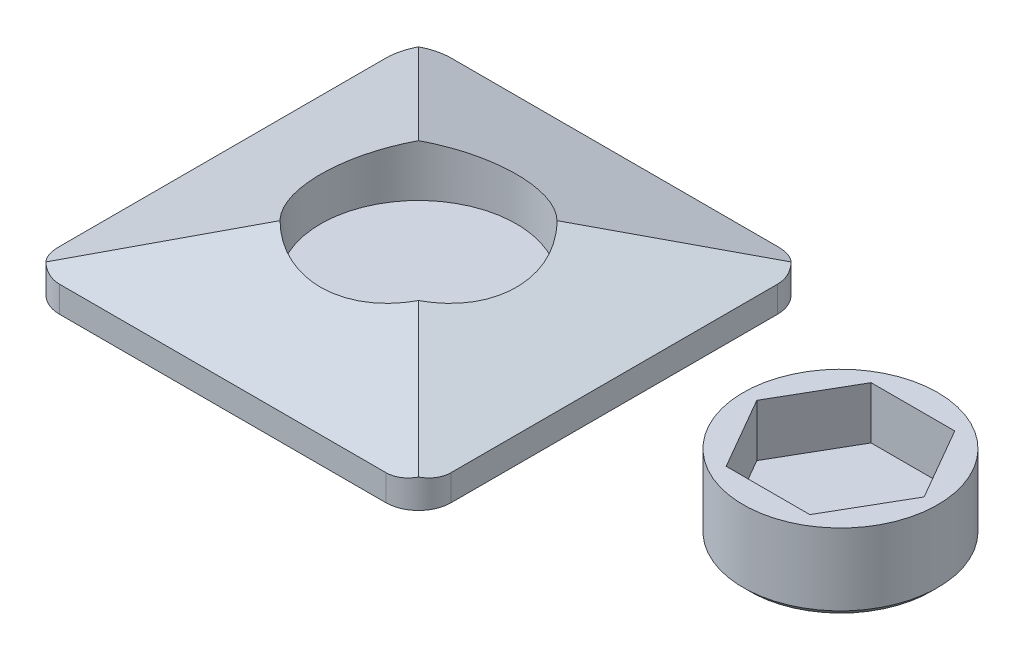
ISO-10303-21;
HEADER;
FILE_DESCRIPTION(('STEP AP214'),'2;1');
FILE_NAME('part.step','',(''),(''),'','','');
FILE_SCHEMA(('AUTOMOTIVE_DESIGN { 1 0 10303 214 1 1 1 1 }'));
ENDSEC;
DATA;
#1=APPLICATION_CONTEXT('core data for automotive mechanical design processes');
#2=APPLICATION_PROTOCOL_DEFINITION('international standard','automotive_design',2000,#1);
#3=PRODUCT_CONTEXT('',#1,'mechanical');
#4=PRODUCT('Part','Part','',(#3));
#5=PRODUCT_RELATED_PRODUCT_CATEGORY('part','',(#4));
#6=PRODUCT_DEFINITION_FORMATION('','',#4);
#7=PRODUCT_DEFINITION_CONTEXT('part definition',#1,'design');
#8=PRODUCT_DEFINITION('design','',#6,#7);
#9=PRODUCT_DEFINITION_SHAPE('','',#8);
#10=(LENGTH_UNIT() NAMED_UNIT(*) SI_UNIT(.MILLI.,.METRE.));
#11=(NAMED_UNIT(*) PLANE_ANGLE_UNIT() SI_UNIT($,.RADIAN.));
#12=(NAMED_UNIT(*) SI_UNIT($,.STERADIAN.) SOLID_ANGLE_UNIT());
#13=UNCERTAINTY_MEASURE_WITH_UNIT(LENGTH_MEASURE(1.E-05),#10,'distance_accuracy_value','');
#14=(GEOMETRIC_REPRESENTATION_CONTEXT(3) GLOBAL_UNCERTAINTY_ASSIGNED_CONTEXT((#13)) GLOBAL_UNIT_ASSIGNED_CONTEXT((#10,
#11,#12)) REPRESENTATION_CONTEXT('',''));
#15=CARTESIAN_POINT('',(0.,0.,0.));
#16=DIRECTION('',(0.,0.,1.));
#17=DIRECTION('',(1.,0.,0.));
#18=AXIS2_PLACEMENT_3D('',#15,#16,#17);
#19=CARTESIAN_POINT('',(64.6418358895324,12.,0.));
#20=DIRECTION('',(0.,-1.,0.));
#21=DIRECTION('',(0.,0.,-1.));
#22=AXIS2_PLACEMENT_3D('',#19,#20,#21);
#23=CYLINDRICAL_SURFACE('',#22,14.9);
#24=CARTESIAN_POINT('',(64.6418358895324,0.999999999999989,0.));
#25=DIRECTION('',(0.,-1.,0.));
#26=DIRECTION('',(0.,0.,-1.));
#27=AXIS2_PLACEMENT_3D('',#24,#25,#26);
#28=CIRCLE('',#27,14.9);
#29=CARTESIAN_POINT('',(64.6418358895324,0.999999999999989,-14.9));
#30=VERTEX_POINT('',#29);
#31=EDGE_CURVE('E12',#30,#30,#28,.F.);
#32=ORIENTED_EDGE('',*,*,#31,.T.);
#33=EDGE_LOOP('',(#32));
#34=FACE_BOUND('',#33,.T.);
#35=CARTESIAN_POINT('',(64.6418358895324,12.,0.));
#36=DIRECTION('',(0.,-1.,0.));
#37=DIRECTION('',(0.,0.,-1.));
#38=AXIS2_PLACEMENT_3D('',#35,#36,#37);
#39=CIRCLE('',#38,14.9);
#40=CARTESIAN_POINT('',(64.6418358895324,12.,-14.9));
#41=VERTEX_POINT('',#40);
#42=EDGE_CURVE('E154',#41,#41,#39,.T.);
#43=ORIENTED_EDGE('',*,*,#42,.T.);
#44=EDGE_LOOP('',(#43));
#45=FACE_BOUND('',#44,.T.);
#46=ADVANCED_FACE('F51',(#34,#45),#23,.T.);
#47=CARTESIAN_POINT('',(64.6418358895324,12.,0.));
#48=DIRECTION('',(0.,-1.,0.));
#49=DIRECTION('',(0.,0.,-1.));
#50=AXIS2_PLACEMENT_3D('',#47,#48,#49);
#51=PLANE('',#50);
#52=DIRECTION('',(-0.5,0.,-0.866025403784438));
#53=VECTOR('',#52,1.);
#54=CARTESIAN_POINT('',(77.4590118655421,12.,0.));
#55=LINE('',#54,#53);
#56=CARTESIAN_POINT('',(77.4590118655421,12.,0.));
#57=VERTEX_POINT('',#56);
#58=CARTESIAN_POINT('',(71.0504238775373,12.,-11.1));
#59=VERTEX_POINT('',#58);
#60=EDGE_CURVE('E141',#57,#59,#55,.T.);
#61=ORIENTED_EDGE('',*,*,#60,.F.);
#62=DIRECTION('',(0.5,0.,-0.866025403784439));
#63=VECTOR('',#62,1.);
#64=CARTESIAN_POINT('',(71.0504238775373,12.,11.1));
#65=LINE('',#64,#63);
#66=CARTESIAN_POINT('',(71.0504238775373,12.,11.1));
#67=VERTEX_POINT('',#66);
#68=EDGE_CURVE('E67',#67,#57,#65,.T.);
#69=ORIENTED_EDGE('',*,*,#68,.F.);
#70=DIRECTION('',(1.,0.,0.));
#71=VECTOR('',#70,1.);
#72=CARTESIAN_POINT('',(58.2332479015276,12.,11.1));
#73=LINE('',#72,#71);
#74=CARTESIAN_POINT('',(58.2332479015276,12.,11.1));
#75=VERTEX_POINT('',#74);
#76=EDGE_CURVE('E150',#75,#67,#73,.T.);
#77=ORIENTED_EDGE('',*,*,#76,.F.);
#78=DIRECTION('',(0.5,0.,0.866025403784439));
#79=VECTOR('',#78,1.);
#80=CARTESIAN_POINT('',(51.8246599135227,12.,0.));
#81=LINE('',#80,#79);
#82=CARTESIAN_POINT('',(51.8246599135227,12.,0.));
#83=VERTEX_POINT('',#82);
#84=EDGE_CURVE('E148',#83,#75,#81,.T.);
#85=ORIENTED_EDGE('',*,*,#84,.F.);
#86=DIRECTION('',(-0.5,0.,0.866025403784439));
#87=VECTOR('',#86,1.);
#88=CARTESIAN_POINT('',(58.2332479015276,12.,-11.1));
#89=LINE('',#88,#87);
#90=CARTESIAN_POINT('',(58.2332479015276,12.,-11.1));
#91=VERTEX_POINT('',#90);
#92=EDGE_CURVE('E115',#91,#83,#89,.T.);
#93=ORIENTED_EDGE('',*,*,#92,.F.);
#94=DIRECTION('',(-1.,0.,0.));
#95=VECTOR('',#94,1.);
#96=CARTESIAN_POINT('',(71.0504238775373,12.,-11.1));
#97=LINE('',#96,#95);
#98=EDGE_CURVE('E144',#59,#91,#97,.T.);
#99=ORIENTED_EDGE('',*,*,#98,.F.);
#100=EDGE_LOOP('',(#61,#69,#77,#85,#93,#99));
#101=FACE_BOUND('',#100,.T.);
#102=ORIENTED_EDGE('',*,*,#42,.F.);
#103=EDGE_LOOP('',(#102));
#104=FACE_BOUND('',#103,.T.);
#105=ADVANCED_FACE('F175',(#101,#104),#51,.F.);
#106=CARTESIAN_POINT('',(64.6418358895324,0.,0.));
#107=DIRECTION('',(0.,-1.,0.));
#108=DIRECTION('',(0.,0.,-1.));
#109=AXIS2_PLACEMENT_3D('',#106,#107,#108);
#110=PLANE('',#109);
#111=CARTESIAN_POINT('',(64.6418358895324,0.,0.));
#112=DIRECTION('',(0.,-1.,0.));
#113=DIRECTION('',(0.,0.,-1.));
#114=AXIS2_PLACEMENT_3D('',#111,#112,#113);
#115=CIRCLE('',#114,13.9);
#116=CARTESIAN_POINT('',(64.6418358895324,0.,-13.9));
#117=VERTEX_POINT('',#116);
#118=EDGE_CURVE('E60',#117,#117,#115,.T.);
#119=ORIENTED_EDGE('',*,*,#118,.T.);
#120=EDGE_LOOP('',(#119));
#121=FACE_BOUND('',#120,.T.);
#122=ADVANCED_FACE('F164',(#121),#110,.T.);
#123=CARTESIAN_POINT('',(71.0504238775373,4.,11.1));
#124=DIRECTION('',(0.866025403784439,0.,0.5));
#125=DIRECTION('',(0.5,0.,-0.866025403784439));
#126=AXIS2_PLACEMENT_3D('',#123,#124,#125);
#127=PLANE('',#126);
#128=ORIENTED_EDGE('',*,*,#68,.T.);
#129=DIRECTION('',(0.,1.,0.));
#130=VECTOR('',#129,1.);
#131=CARTESIAN_POINT('',(77.4590118655421,4.,0.));
#132=LINE('',#131,#130);
#133=CARTESIAN_POINT('',(77.4590118655421,4.,0.));
#134=VERTEX_POINT('',#133);
#135=EDGE_CURVE('E97',#134,#57,#132,.T.);
#136=ORIENTED_EDGE('',*,*,#135,.F.);
#137=DIRECTION('',(0.5,0.,-0.866025403784439));
#138=VECTOR('',#137,1.);
#139=CARTESIAN_POINT('',(71.0504238775373,4.,11.1));
#140=LINE('',#139,#138);
#141=CARTESIAN_POINT('',(71.0504238775373,4.,11.1));
#142=VERTEX_POINT('',#141);
#143=EDGE_CURVE('E152',#142,#134,#140,.T.);
#144=ORIENTED_EDGE('',*,*,#143,.F.);
#145=DIRECTION('',(0.,1.,0.));
#146=VECTOR('',#145,1.);
#147=CARTESIAN_POINT('',(71.0504238775373,4.,11.1));
#148=LINE('',#147,#146);
#149=EDGE_CURVE('E75',#142,#67,#148,.T.);
#150=ORIENTED_EDGE('',*,*,#149,.T.);
#151=EDGE_LOOP('',(#128,#136,#144,#150));
#152=FACE_BOUND('',#151,.T.);
#153=ADVANCED_FACE('F185',(#152),#127,.F.);
#154=CARTESIAN_POINT('',(58.2332479015276,4.,11.1));
#155=DIRECTION('',(0.,0.,1.));
#156=DIRECTION('',(1.,0.,0.));
#157=AXIS2_PLACEMENT_3D('',#154,#155,#156);
#158=PLANE('',#157);
#159=ORIENTED_EDGE('',*,*,#76,.T.);
#160=ORIENTED_EDGE('',*,*,#149,.F.);
#161=DIRECTION('',(1.,0.,0.));
#162=VECTOR('',#161,1.);
#163=CARTESIAN_POINT('',(58.2332479015276,4.,11.1));
#164=LINE('',#163,#162);
#165=CARTESIAN_POINT('',(58.2332479015276,4.,11.1));
#166=VERTEX_POINT('',#165);
#167=EDGE_CURVE('E127',#166,#142,#164,.T.);
#168=ORIENTED_EDGE('',*,*,#167,.F.);
#169=DIRECTION('',(0.,1.,0.));
#170=VECTOR('',#169,1.);
#171=CARTESIAN_POINT('',(58.2332479015276,4.,11.1));
#172=LINE('',#171,#170);
#173=EDGE_CURVE('E119',#166,#75,#172,.T.);
#174=ORIENTED_EDGE('',*,*,#173,.T.);
#175=EDGE_LOOP('',(#159,#160,#168,#174));
#176=FACE_BOUND('',#175,.T.);
#177=ADVANCED_FACE('F189',(#176),#158,.F.);
#178=CARTESIAN_POINT('',(51.8246599135227,4.,0.));
#179=DIRECTION('',(-0.866025403784439,0.,0.5));
#180=DIRECTION('',(0.5,0.,0.866025403784439));
#181=AXIS2_PLACEMENT_3D('',#178,#179,#180);
#182=PLANE('',#181);
#183=ORIENTED_EDGE('',*,*,#84,.T.);
#184=ORIENTED_EDGE('',*,*,#173,.F.);
#185=DIRECTION('',(0.5,0.,0.866025403784439));
#186=VECTOR('',#185,1.);
#187=CARTESIAN_POINT('',(51.8246599135227,4.,0.));
#188=LINE('',#187,#186);
#189=CARTESIAN_POINT('',(51.8246599135227,4.,0.));
#190=VERTEX_POINT('',#189);
#191=EDGE_CURVE('E123',#190,#166,#188,.T.);
#192=ORIENTED_EDGE('',*,*,#191,.F.);
#193=DIRECTION('',(0.,1.,0.));
#194=VECTOR('',#193,1.);
#195=CARTESIAN_POINT('',(51.8246599135227,4.,0.));
#196=LINE('',#195,#194);
#197=EDGE_CURVE('E108',#190,#83,#196,.T.);
#198=ORIENTED_EDGE('',*,*,#197,.T.);
#199=EDGE_LOOP('',(#183,#184,#192,#198));
#200=FACE_BOUND('',#199,.T.);
#201=ADVANCED_FACE('F124',(#200),#182,.F.);
#202=CARTESIAN_POINT('',(58.2332479015276,4.,-11.1));
#203=DIRECTION('',(-0.866025403784439,0.,-0.5));
#204=DIRECTION('',(-0.5,0.,0.866025403784439));
#205=AXIS2_PLACEMENT_3D('',#202,#203,#204);
#206=PLANE('',#205);
#207=ORIENTED_EDGE('',*,*,#92,.T.);
#208=ORIENTED_EDGE('',*,*,#197,.F.);
#209=DIRECTION('',(-0.5,0.,0.866025403784439));
#210=VECTOR('',#209,1.);
#211=CARTESIAN_POINT('',(58.2332479015276,4.,-11.1));
#212=LINE('',#211,#210);
#213=CARTESIAN_POINT('',(58.2332479015276,4.,-11.1));
#214=VERTEX_POINT('',#213);
#215=EDGE_CURVE('E112',#214,#190,#212,.T.);
#216=ORIENTED_EDGE('',*,*,#215,.F.);
#217=DIRECTION('',(0.,1.,0.));
#218=VECTOR('',#217,1.);
#219=CARTESIAN_POINT('',(58.2332479015276,4.,-11.1));
#220=LINE('',#219,#218);
#221=EDGE_CURVE('E120',#214,#91,#220,.T.);
#222=ORIENTED_EDGE('',*,*,#221,.T.);
#223=EDGE_LOOP('',(#207,#208,#216,#222));
#224=FACE_BOUND('',#223,.T.);
#225=ADVANCED_FACE('F110',(#224),#206,.F.);
#226=CARTESIAN_POINT('',(71.0504238775373,4.,-11.1));
#227=DIRECTION('',(0.,0.,-1.));
#228=DIRECTION('',(-1.,0.,0.));
#229=AXIS2_PLACEMENT_3D('',#226,#227,#228);
#230=PLANE('',#229);
#231=ORIENTED_EDGE('',*,*,#98,.T.);
#232=ORIENTED_EDGE('',*,*,#221,.F.);
#233=DIRECTION('',(-1.,0.,0.));
#234=VECTOR('',#233,1.);
#235=CARTESIAN_POINT('',(71.0504238775373,4.,-11.1));
#236=LINE('',#235,#234);
#237=CARTESIAN_POINT('',(71.0504238775373,4.,-11.1));
#238=VERTEX_POINT('',#237);
#239=EDGE_CURVE('E133',#238,#214,#236,.T.);
#240=ORIENTED_EDGE('',*,*,#239,.F.);
#241=DIRECTION('',(0.,1.,0.));
#242=VECTOR('',#241,1.);
#243=CARTESIAN_POINT('',(71.0504238775373,4.,-11.1));
#244=LINE('',#243,#242);
#245=EDGE_CURVE('E157',#238,#59,#244,.T.);
#246=ORIENTED_EDGE('',*,*,#245,.T.);
#247=EDGE_LOOP('',(#231,#232,#240,#246));
#248=FACE_BOUND('',#247,.T.);
#249=ADVANCED_FACE('F192',(#248),#230,.F.);
#250=CARTESIAN_POINT('',(77.4590118655421,4.,0.));
#251=DIRECTION('',(0.866025403784439,0.,-0.5));
#252=DIRECTION('',(-0.5,0.,-0.866025403784438));
#253=AXIS2_PLACEMENT_3D('',#250,#251,#252);
#254=PLANE('',#253);
#255=ORIENTED_EDGE('',*,*,#60,.T.);
#256=ORIENTED_EDGE('',*,*,#245,.F.);
#257=DIRECTION('',(-0.5,0.,-0.866025403784438));
#258=VECTOR('',#257,1.);
#259=CARTESIAN_POINT('',(77.4590118655421,4.,0.));
#260=LINE('',#259,#258);
#261=EDGE_CURVE('E135',#134,#238,#260,.T.);
#262=ORIENTED_EDGE('',*,*,#261,.F.);
#263=ORIENTED_EDGE('',*,*,#135,.T.);
#264=EDGE_LOOP('',(#255,#256,#262,#263));
#265=FACE_BOUND('',#264,.T.);
#266=ADVANCED_FACE('F171',(#265),#254,.F.);
#267=CARTESIAN_POINT('',(0.,4.,0.));
#268=DIRECTION('',(0.,1.,0.));
#269=DIRECTION('',(0.,0.,1.));
#270=AXIS2_PLACEMENT_3D('',#267,#268,#269);
#271=PLANE('',#270);
#272=ORIENTED_EDGE('',*,*,#143,.T.);
#273=ORIENTED_EDGE('',*,*,#261,.T.);
#274=ORIENTED_EDGE('',*,*,#239,.T.);
#275=ORIENTED_EDGE('',*,*,#215,.T.);
#276=ORIENTED_EDGE('',*,*,#191,.T.);
#277=ORIENTED_EDGE('',*,*,#167,.T.);
#278=EDGE_LOOP('',(#272,#273,#274,#275,#276,#277));
#279=FACE_BOUND('',#278,.T.);
#280=ADVANCED_FACE('F130',(#279),#271,.T.);
#281=CARTESIAN_POINT('',(64.6418358895324,0.,0.));
#282=DIRECTION('',(0.,1.,0.));
#283=DIRECTION('',(0.,0.,1.));
#284=AXIS2_PLACEMENT_3D('',#281,#282,#283);
#285=CONICAL_SURFACE('',#284,13.9,0.785398163397447);
#286=ORIENTED_EDGE('',*,*,#31,.F.);
#287=EDGE_LOOP('',(#286));
#288=FACE_BOUND('',#287,.T.);
#289=ORIENTED_EDGE('',*,*,#118,.F.);
#290=EDGE_LOOP('',(#289));
#291=FACE_BOUND('',#290,.T.);
#292=ADVANCED_FACE('F54',(#288,#291),#285,.T.);
#293=CLOSED_SHELL('',(#46,#105,#122,#153,#177,#201,#225,#249,#266,#280,#292));
#294=MANIFOLD_SOLID_BREP('B2',#293);
#295=CARTESIAN_POINT('',(30.,10.,-30.));
#296=DIRECTION('',(-1.,0.,0.));
#297=DIRECTION('',(0.,0.,1.));
#298=AXIS2_PLACEMENT_3D('',#295,#296,#297);
#299=PLANE('',#298);
#300=DIRECTION('',(0.,0.,-1.));
#301=VECTOR('',#300,1.);
#302=CARTESIAN_POINT('',(30.,0.,-30.));
#303=LINE('',#302,#301);
#304=CARTESIAN_POINT('',(30.,0.,25.));
#305=VERTEX_POINT('',#304);
#306=CARTESIAN_POINT('',(30.,0.,-25.));
#307=VERTEX_POINT('',#306);
#308=EDGE_CURVE('E497',#305,#307,#303,.T.);
#309=ORIENTED_EDGE('',*,*,#308,.T.);
#310=DIRECTION('',(0.,-1.,0.));
#311=VECTOR('',#310,1.);
#312=CARTESIAN_POINT('',(30.,10.,-25.));
#313=LINE('',#312,#311);
#314=CARTESIAN_POINT('',(30.,3.99999999999986,-25.));
#315=VERTEX_POINT('',#314);
#316=EDGE_CURVE('E340',#307,#315,#313,.F.);
#317=ORIENTED_EDGE('',*,*,#316,.T.);
#318=DIRECTION('',(0.,0.,1.));
#319=VECTOR('',#318,1.);
#320=CARTESIAN_POINT('',(30.,3.99999999999986,30.));
#321=LINE('',#320,#319);
#322=CARTESIAN_POINT('',(30.,3.99999999999986,25.));
#323=VERTEX_POINT('',#322);
#324=EDGE_CURVE('E452',#315,#323,#321,.T.);
#325=ORIENTED_EDGE('',*,*,#324,.T.);
#326=DIRECTION('',(0.,-1.,0.));
#327=VECTOR('',#326,1.);
#328=CARTESIAN_POINT('',(30.,10.,25.));
#329=LINE('',#328,#327);
#330=EDGE_CURVE('E492',#323,#305,#329,.T.);
#331=ORIENTED_EDGE('',*,*,#330,.T.);
#332=EDGE_LOOP('',(#309,#317,#325,#331));
#333=FACE_BOUND('',#332,.T.);
#334=ADVANCED_FACE('F319',(#333),#299,.F.);
#335=CARTESIAN_POINT('',(-30.,10.,-30.));
#336=DIRECTION('',(0.,0.,1.));
#337=DIRECTION('',(1.,0.,0.));
#338=AXIS2_PLACEMENT_3D('',#335,#336,#337);
#339=PLANE('',#338);
#340=DIRECTION('',(-1.,0.,0.));
#341=VECTOR('',#340,1.);
#342=CARTESIAN_POINT('',(-30.,0.,-30.));
#343=LINE('',#342,#341);
#344=CARTESIAN_POINT('',(25.,0.,-30.));
#345=VERTEX_POINT('',#344);
#346=CARTESIAN_POINT('',(-25.,0.,-30.));
#347=VERTEX_POINT('',#346);
#348=EDGE_CURVE('E504',#345,#347,#343,.T.);
#349=ORIENTED_EDGE('',*,*,#348,.T.);
#350=DIRECTION('',(0.,-1.,0.));
#351=VECTOR('',#350,1.);
#352=CARTESIAN_POINT('',(-25.,10.,-30.));
#353=LINE('',#352,#351);
#354=CARTESIAN_POINT('',(-25.,3.99999999999986,-30.));
#355=VERTEX_POINT('',#354);
#356=EDGE_CURVE('E474',#347,#355,#353,.F.);
#357=ORIENTED_EDGE('',*,*,#356,.T.);
#358=DIRECTION('',(1.,0.,0.));
#359=VECTOR('',#358,1.);
#360=CARTESIAN_POINT('',(30.,3.99999999999986,-30.));
#361=LINE('',#360,#359);
#362=CARTESIAN_POINT('',(25.,3.99999999999986,-30.));
#363=VERTEX_POINT('',#362);
#364=EDGE_CURVE('E443',#355,#363,#361,.T.);
#365=ORIENTED_EDGE('',*,*,#364,.T.);
#366=DIRECTION('',(0.,-1.,0.));
#367=VECTOR('',#366,1.);
#368=CARTESIAN_POINT('',(25.,10.,-30.));
#369=LINE('',#368,#367);
#370=EDGE_CURVE('E471',#363,#345,#369,.T.);
#371=ORIENTED_EDGE('',*,*,#370,.T.);
#372=EDGE_LOOP('',(#349,#357,#365,#371));
#373=FACE_BOUND('',#372,.T.);
#374=ADVANCED_FACE('F534',(#373),#339,.F.);
#375=CARTESIAN_POINT('',(-30.,10.,-30.));
#376=DIRECTION('',(1.,0.,0.));
#377=DIRECTION('',(0.,0.,-1.));
#378=AXIS2_PLACEMENT_3D('',#375,#376,#377);
#379=PLANE('',#378);
#380=DIRECTION('',(0.,0.,-1.));
#381=VECTOR('',#380,1.);
#382=CARTESIAN_POINT('',(-30.,3.99999999999986,-30.));
#383=LINE('',#382,#381);
#384=CARTESIAN_POINT('',(-30.,3.99999999999986,25.));
#385=VERTEX_POINT('',#384);
#386=CARTESIAN_POINT('',(-30.,3.99999999999986,-25.));
#387=VERTEX_POINT('',#386);
#388=EDGE_CURVE('E446',#385,#387,#383,.T.);
#389=ORIENTED_EDGE('',*,*,#388,.T.);
#390=DIRECTION('',(0.,-1.,0.));
#391=VECTOR('',#390,1.);
#392=CARTESIAN_POINT('',(-30.,10.,-25.));
#393=LINE('',#392,#391);
#394=CARTESIAN_POINT('',(-30.,0.,-25.));
#395=VERTEX_POINT('',#394);
#396=EDGE_CURVE('E460',#387,#395,#393,.T.);
#397=ORIENTED_EDGE('',*,*,#396,.T.);
#398=DIRECTION('',(0.,0.,1.));
#399=VECTOR('',#398,1.);
#400=CARTESIAN_POINT('',(-30.,0.,-30.));
#401=LINE('',#400,#399);
#402=CARTESIAN_POINT('',(-30.,0.,25.));
#403=VERTEX_POINT('',#402);
#404=EDGE_CURVE('E436',#395,#403,#401,.T.);
#405=ORIENTED_EDGE('',*,*,#404,.T.);
#406=DIRECTION('',(0.,-1.,0.));
#407=VECTOR('',#406,1.);
#408=CARTESIAN_POINT('',(-30.,10.,25.));
#409=LINE('',#408,#407);
#410=EDGE_CURVE('E454',#403,#385,#409,.F.);
#411=ORIENTED_EDGE('',*,*,#410,.T.);
#412=EDGE_LOOP('',(#389,#397,#405,#411));
#413=FACE_BOUND('',#412,.T.);
#414=ADVANCED_FACE('F513',(#413),#379,.F.);
#415=CARTESIAN_POINT('',(-30.,10.,30.));
#416=DIRECTION('',(0.,0.,-1.));
#417=DIRECTION('',(-1.,0.,0.));
#418=AXIS2_PLACEMENT_3D('',#415,#416,#417);
#419=PLANE('',#418);
#420=DIRECTION('',(-1.,0.,0.));
#421=VECTOR('',#420,1.);
#422=CARTESIAN_POINT('',(-30.,3.99999999999986,30.));
#423=LINE('',#422,#421);
#424=CARTESIAN_POINT('',(25.,3.99999999999986,30.));
#425=VERTEX_POINT('',#424);
#426=CARTESIAN_POINT('',(-25.,3.99999999999986,30.));
#427=VERTEX_POINT('',#426);
#428=EDGE_CURVE('E449',#425,#427,#423,.T.);
#429=ORIENTED_EDGE('',*,*,#428,.T.);
#430=DIRECTION('',(0.,-1.,0.));
#431=VECTOR('',#430,1.);
#432=CARTESIAN_POINT('',(-25.,10.,30.));
#433=LINE('',#432,#431);
#434=CARTESIAN_POINT('',(-25.,0.,30.));
#435=VERTEX_POINT('',#434);
#436=EDGE_CURVE('E486',#427,#435,#433,.T.);
#437=ORIENTED_EDGE('',*,*,#436,.T.);
#438=DIRECTION('',(1.,0.,0.));
#439=VECTOR('',#438,1.);
#440=CARTESIAN_POINT('',(-30.,0.,30.));
#441=LINE('',#440,#439);
#442=CARTESIAN_POINT('',(25.,0.,30.));
#443=VERTEX_POINT('',#442);
#444=EDGE_CURVE('E433',#435,#443,#441,.T.);
#445=ORIENTED_EDGE('',*,*,#444,.T.);
#446=DIRECTION('',(0.,-1.,0.));
#447=VECTOR('',#446,1.);
#448=CARTESIAN_POINT('',(25.,10.,30.));
#449=LINE('',#448,#447);
#450=EDGE_CURVE('E484',#443,#425,#449,.F.);
#451=ORIENTED_EDGE('',*,*,#450,.T.);
#452=EDGE_LOOP('',(#429,#437,#445,#451));
#453=FACE_BOUND('',#452,.T.);
#454=ADVANCED_FACE('F525',(#453),#419,.F.);
#455=CARTESIAN_POINT('',(0.,0.,0.));
#456=DIRECTION('',(0.,1.,0.));
#457=DIRECTION('',(0.,0.,1.));
#458=AXIS2_PLACEMENT_3D('',#455,#456,#457);
#459=PLANE('',#458);
#460=ORIENTED_EDGE('',*,*,#404,.F.);
#461=CARTESIAN_POINT('',(-25.,0.,-25.));
#462=DIRECTION('',(0.,1.,0.));
#463=DIRECTION('',(0.,0.,1.));
#464=AXIS2_PLACEMENT_3D('',#461,#462,#463);
#465=CIRCLE('',#464,5.);
#466=EDGE_CURVE('E469',#395,#347,#465,.F.);
#467=ORIENTED_EDGE('',*,*,#466,.T.);
#468=ORIENTED_EDGE('',*,*,#348,.F.);
#469=CARTESIAN_POINT('',(25.,0.,-25.));
#470=DIRECTION('',(0.,1.,0.));
#471=DIRECTION('',(0.,0.,1.));
#472=AXIS2_PLACEMENT_3D('',#469,#470,#471);
#473=CIRCLE('',#472,5.);
#474=EDGE_CURVE('E465',#345,#307,#473,.F.);
#475=ORIENTED_EDGE('',*,*,#474,.T.);
#476=ORIENTED_EDGE('',*,*,#308,.F.);
#477=CARTESIAN_POINT('',(25.,0.,25.));
#478=DIRECTION('',(0.,1.,0.));
#479=DIRECTION('',(0.,0.,1.));
#480=AXIS2_PLACEMENT_3D('',#477,#478,#479);
#481=CIRCLE('',#480,5.);
#482=EDGE_CURVE('E463',#305,#443,#481,.F.);
#483=ORIENTED_EDGE('',*,*,#482,.T.);
#484=ORIENTED_EDGE('',*,*,#444,.F.);
#485=CARTESIAN_POINT('',(-25.,0.,25.));
#486=DIRECTION('',(0.,1.,0.));
#487=DIRECTION('',(0.,0.,1.));
#488=AXIS2_PLACEMENT_3D('',#485,#486,#487);
#489=CIRCLE('',#488,5.);
#490=EDGE_CURVE('E467',#435,#403,#489,.F.);
#491=ORIENTED_EDGE('',*,*,#490,.T.);
#492=EDGE_LOOP('',(#460,#467,#468,#475,#476,#483,#484,#491));
#493=FACE_BOUND('',#492,.T.);
#494=ADVANCED_FACE('F501',(#493),#459,.F.);
#495=CARTESIAN_POINT('',(0.,2.,0.));
#496=DIRECTION('',(0.,1.,0.));
#497=DIRECTION('',(0.,0.,1.));
#498=AXIS2_PLACEMENT_3D('',#495,#496,#497);
#499=CYLINDRICAL_SURFACE('',#498,15.);
#500=CARTESIAN_POINT('',(0.,13.1719204437596,0.));
#501=DIRECTION('',(0.292371704722734,0.956304755963036,0.));
#502=DIRECTION('',(-0.956304755963037,0.292371704722734,0.));
#503=AXIS2_PLACEMENT_3D('',#500,#501,#502);
#504=ELLIPSE('',#503,15.6853763473072,15.);
#505=CARTESIAN_POINT('',(10.6066017177982,9.92915687261656,10.6066017177982));
#506=VERTEX_POINT('',#505);
#507=CARTESIAN_POINT('',(10.6066017177982,9.92915687261656,-10.6066017177982));
#508=VERTEX_POINT('',#507);
#509=EDGE_CURVE('E414',#506,#508,#504,.T.);
#510=ORIENTED_EDGE('',*,*,#509,.T.);
#511=CARTESIAN_POINT('',(0.,13.1719204437596,0.));
#512=DIRECTION('',(0.,0.956304755963036,-0.292371704722734));
#513=DIRECTION('',(0.,0.292371704722734,0.956304755963037));
#514=AXIS2_PLACEMENT_3D('',#511,#512,#513);
#515=ELLIPSE('',#514,15.6853763473072,15.);
#516=CARTESIAN_POINT('',(-10.6066017177982,9.92915687261656,-10.6066017177982));
#517=VERTEX_POINT('',#516);
#518=EDGE_CURVE('E441',#508,#517,#515,.T.);
#519=ORIENTED_EDGE('',*,*,#518,.T.);
#520=CARTESIAN_POINT('',(0.,13.1719204437596,0.));
#521=DIRECTION('',(-0.292371704722734,0.956304755963036,0.));
#522=DIRECTION('',(0.956304755963037,0.292371704722734,0.));
#523=AXIS2_PLACEMENT_3D('',#520,#521,#522);
#524=ELLIPSE('',#523,15.6853763473072,15.);
#525=CARTESIAN_POINT('',(-10.6066017177982,9.92915687261656,10.6066017177982));
#526=VERTEX_POINT('',#525);
#527=EDGE_CURVE('E417',#517,#526,#524,.T.);
#528=ORIENTED_EDGE('',*,*,#527,.T.);
#529=CARTESIAN_POINT('',(0.,13.1719204437596,0.));
#530=DIRECTION('',(0.,0.956304755963036,0.292371704722734));
#531=DIRECTION('',(0.,0.292371704722734,-0.956304755963037));
#532=AXIS2_PLACEMENT_3D('',#529,#530,#531);
#533=ELLIPSE('',#532,15.6853763473072,15.);
#534=EDGE_CURVE('E408',#526,#506,#533,.T.);
#535=ORIENTED_EDGE('',*,*,#534,.T.);
#536=EDGE_LOOP('',(#510,#519,#528,#535));
#537=FACE_BOUND('',#536,.T.);
#538=CARTESIAN_POINT('',(0.,2.,0.));
#539=DIRECTION('',(0.,1.,0.));
#540=DIRECTION('',(0.,0.,1.));
#541=AXIS2_PLACEMENT_3D('',#538,#539,#540);
#542=CIRCLE('',#541,15.);
#543=CARTESIAN_POINT('',(0.,2.,15.));
#544=VERTEX_POINT('',#543);
#545=EDGE_CURVE('E426',#544,#544,#542,.T.);
#546=ORIENTED_EDGE('',*,*,#545,.F.);
#547=EDGE_LOOP('',(#546));
#548=FACE_BOUND('',#547,.T.);
#549=ADVANCED_FACE('F410',(#537,#548),#499,.F.);
#550=CARTESIAN_POINT('',(0.,2.,0.));
#551=DIRECTION('',(0.,1.,0.));
#552=DIRECTION('',(0.,0.,1.));
#553=AXIS2_PLACEMENT_3D('',#550,#551,#552);
#554=PLANE('',#553);
#555=ORIENTED_EDGE('',*,*,#545,.T.);
#556=EDGE_LOOP('',(#555));
#557=FACE_BOUND('',#556,.T.);
#558=ADVANCED_FACE('F566',(#557),#554,.T.);
#559=CARTESIAN_POINT('',(0.,10.,10.3748842890945));
#560=DIRECTION('',(0.,0.956304755963036,0.292371704722734));
#561=DIRECTION('',(-1.,0.,0.));
#562=AXIS2_PLACEMENT_3D('',#559,#560,#561);
#563=PLANE('',#562);
#564=DIRECTION('',(-0.69114074934468,-0.211302932280996,0.69114074934468));
#565=VECTOR('',#564,1.);
#566=CARTESIAN_POINT('',(-5.4190558815392,11.5151487962341,5.41905588153919));
#567=LINE('',#566,#565);
#568=CARTESIAN_POINT('',(-28.5355339059327,4.44773221691215,28.5355339059327));
#569=VERTEX_POINT('',#568);
#570=EDGE_CURVE('E427',#569,#526,#567,.F.);
#571=ORIENTED_EDGE('',*,*,#570,.F.);
#572=CARTESIAN_POINT('',(-25.,5.52865340729315,25.));
#573=DIRECTION('',(0.,0.956304755963036,0.292371704722734));
#574=DIRECTION('',(0.,-0.292371704722734,0.956304755963037));
#575=AXIS2_PLACEMENT_3D('',#572,#573,#574);
#576=ELLIPSE('',#575,5.22845878243574,5.);
#577=EDGE_CURVE('E490',#569,#427,#576,.T.);
#578=ORIENTED_EDGE('',*,*,#577,.T.);
#579=ORIENTED_EDGE('',*,*,#428,.F.);
#580=CARTESIAN_POINT('',(25.,5.52865340729315,25.));
#581=DIRECTION('',(0.,0.956304755963036,0.292371704722734));
#582=DIRECTION('',(0.,-0.292371704722734,0.956304755963037));
#583=AXIS2_PLACEMENT_3D('',#580,#581,#582);
#584=ELLIPSE('',#583,5.22845878243574,5.);
#585=CARTESIAN_POINT('',(28.5355339059327,4.44773221691215,28.5355339059327));
#586=VERTEX_POINT('',#585);
#587=EDGE_CURVE('E425',#425,#586,#584,.T.);
#588=ORIENTED_EDGE('',*,*,#587,.T.);
#589=DIRECTION('',(0.691140749344681,-0.211302932280996,0.69114074934468));
#590=VECTOR('',#589,1.);
#591=CARTESIAN_POINT('',(5.41905588153919,11.5151487962341,5.41905588153919));
#592=LINE('',#591,#590);
#593=EDGE_CURVE('E421',#506,#586,#592,.T.);
#594=ORIENTED_EDGE('',*,*,#593,.F.);
#595=ORIENTED_EDGE('',*,*,#534,.F.);
#596=EDGE_LOOP('',(#571,#578,#579,#588,#594,#595));
#597=FACE_BOUND('',#596,.T.);
#598=ADVANCED_FACE('F422',(#597),#563,.T.);
#599=CARTESIAN_POINT('',(10.3748842890945,10.,0.));
#600=DIRECTION('',(0.292371704722734,0.956304755963036,0.));
#601=DIRECTION('',(0.,0.,1.));
#602=AXIS2_PLACEMENT_3D('',#599,#600,#601);
#603=PLANE('',#602);
#604=ORIENTED_EDGE('',*,*,#324,.F.);
#605=CARTESIAN_POINT('',(25.,5.52865340729315,-25.));
#606=DIRECTION('',(0.292371704722734,0.956304755963036,0.));
#607=DIRECTION('',(0.956304755963037,-0.292371704722734,0.));
#608=AXIS2_PLACEMENT_3D('',#605,#606,#607);
#609=ELLIPSE('',#608,5.22845878243574,5.);
#610=CARTESIAN_POINT('',(28.5355339059327,4.44773221691215,-28.5355339059327));
#611=VERTEX_POINT('',#610);
#612=EDGE_CURVE('E49',#315,#611,#609,.T.);
#613=ORIENTED_EDGE('',*,*,#612,.T.);
#614=DIRECTION('',(-0.69114074934468,0.211302932280996,0.69114074934468));
#615=VECTOR('',#614,1.);
#616=CARTESIAN_POINT('',(5.41905588153919,11.5151487962341,-5.4190558815392));
#617=LINE('',#616,#615);
#618=EDGE_CURVE('E431',#508,#611,#617,.F.);
#619=ORIENTED_EDGE('',*,*,#618,.F.);
#620=ORIENTED_EDGE('',*,*,#509,.F.);
#621=ORIENTED_EDGE('',*,*,#593,.T.);
#622=CARTESIAN_POINT('',(25.,5.52865340729315,25.));
#623=DIRECTION('',(0.292371704722734,0.956304755963036,0.));
#624=DIRECTION('',(0.956304755963037,-0.292371704722734,0.));
#625=AXIS2_PLACEMENT_3D('',#622,#623,#624);
#626=ELLIPSE('',#625,5.22845878243574,5.);
#627=EDGE_CURVE('E327',#586,#323,#626,.T.);
#628=ORIENTED_EDGE('',*,*,#627,.T.);
#629=EDGE_LOOP('',(#604,#613,#619,#620,#621,#628));
#630=FACE_BOUND('',#629,.T.);
#631=ADVANCED_FACE('F429',(#630),#603,.T.);
#632=CARTESIAN_POINT('',(-10.3748842890945,10.,0.));
#633=DIRECTION('',(-0.292371704722734,0.956304755963036,0.));
#634=DIRECTION('',(0.,0.,-1.));
#635=AXIS2_PLACEMENT_3D('',#632,#633,#634);
#636=PLANE('',#635);
#637=DIRECTION('',(-0.691140749344681,-0.211302932280996,-0.69114074934468));
#638=VECTOR('',#637,1.);
#639=CARTESIAN_POINT('',(-5.4190558815392,11.5151487962341,-5.4190558815392));
#640=LINE('',#639,#638);
#641=CARTESIAN_POINT('',(-28.5355339059327,4.44773221691214,-28.5355339059327));
#642=VERTEX_POINT('',#641);
#643=EDGE_CURVE('E455',#642,#517,#640,.F.);
#644=ORIENTED_EDGE('',*,*,#643,.F.);
#645=CARTESIAN_POINT('',(-25.,5.52865340729315,-25.));
#646=DIRECTION('',(-0.292371704722734,0.956304755963036,0.));
#647=DIRECTION('',(-0.956304755963037,-0.292371704722734,0.));
#648=AXIS2_PLACEMENT_3D('',#645,#646,#647);
#649=ELLIPSE('',#648,5.22845878243574,5.);
#650=EDGE_CURVE('E482',#642,#387,#649,.T.);
#651=ORIENTED_EDGE('',*,*,#650,.T.);
#652=ORIENTED_EDGE('',*,*,#388,.F.);
#653=CARTESIAN_POINT('',(-25.,5.52865340729315,25.));
#654=DIRECTION('',(-0.292371704722734,0.956304755963036,0.));
#655=DIRECTION('',(-0.956304755963037,-0.292371704722734,0.));
#656=AXIS2_PLACEMENT_3D('',#653,#654,#655);
#657=ELLIPSE('',#656,5.22845878243574,5.);
#658=EDGE_CURVE('E480',#385,#569,#657,.T.);
#659=ORIENTED_EDGE('',*,*,#658,.T.);
#660=ORIENTED_EDGE('',*,*,#570,.T.);
#661=ORIENTED_EDGE('',*,*,#527,.F.);
#662=EDGE_LOOP('',(#644,#651,#652,#659,#660,#661));
#663=FACE_BOUND('',#662,.T.);
#664=ADVANCED_FACE('F523',(#663),#636,.T.);
#665=CARTESIAN_POINT('',(0.,10.,-10.3748842890945));
#666=DIRECTION('',(0.,0.956304755963036,-0.292371704722734));
#667=DIRECTION('',(1.,0.,0.));
#668=AXIS2_PLACEMENT_3D('',#665,#666,#667);
#669=PLANE('',#668);
#670=ORIENTED_EDGE('',*,*,#364,.F.);
#671=CARTESIAN_POINT('',(-25.,5.52865340729315,-25.));
#672=DIRECTION('',(0.,0.956304755963036,-0.292371704722734));
#673=DIRECTION('',(0.,-0.292371704722734,-0.956304755963037));
#674=AXIS2_PLACEMENT_3D('',#671,#672,#673);
#675=ELLIPSE('',#674,5.22845878243574,5.);
#676=EDGE_CURVE('E478',#355,#642,#675,.T.);
#677=ORIENTED_EDGE('',*,*,#676,.T.);
#678=ORIENTED_EDGE('',*,*,#643,.T.);
#679=ORIENTED_EDGE('',*,*,#518,.F.);
#680=ORIENTED_EDGE('',*,*,#618,.T.);
#681=CARTESIAN_POINT('',(25.,5.52865340729315,-25.));
#682=DIRECTION('',(0.,0.956304755963036,-0.292371704722734));
#683=DIRECTION('',(0.,-0.292371704722734,-0.956304755963037));
#684=AXIS2_PLACEMENT_3D('',#681,#682,#683);
#685=ELLIPSE('',#684,5.22845878243574,5.);
#686=EDGE_CURVE('E476',#611,#363,#685,.T.);
#687=ORIENTED_EDGE('',*,*,#686,.T.);
#688=EDGE_LOOP('',(#670,#677,#678,#679,#680,#687));
#689=FACE_BOUND('',#688,.T.);
#690=ADVANCED_FACE('F544',(#689),#669,.T.);
#691=CARTESIAN_POINT('',(-25.,10.,-25.));
#692=DIRECTION('',(0.,-1.,0.));
#693=DIRECTION('',(0.,0.,-1.));
#694=AXIS2_PLACEMENT_3D('',#691,#692,#693);
#695=CYLINDRICAL_SURFACE('',#694,5.);
#696=ORIENTED_EDGE('',*,*,#676,.F.);
#697=ORIENTED_EDGE('',*,*,#356,.F.);
#698=ORIENTED_EDGE('',*,*,#466,.F.);
#699=ORIENTED_EDGE('',*,*,#396,.F.);
#700=ORIENTED_EDGE('',*,*,#650,.F.);
#701=EDGE_LOOP('',(#696,#697,#698,#699,#700));
#702=FACE_BOUND('',#701,.T.);
#703=ADVANCED_FACE('F550',(#702),#695,.T.);
#704=CARTESIAN_POINT('',(-25.,10.,25.));
#705=DIRECTION('',(0.,-1.,0.));
#706=DIRECTION('',(0.,0.,-1.));
#707=AXIS2_PLACEMENT_3D('',#704,#705,#706);
#708=CYLINDRICAL_SURFACE('',#707,5.);
#709=ORIENTED_EDGE('',*,*,#658,.F.);
#710=ORIENTED_EDGE('',*,*,#410,.F.);
#711=ORIENTED_EDGE('',*,*,#490,.F.);
#712=ORIENTED_EDGE('',*,*,#436,.F.);
#713=ORIENTED_EDGE('',*,*,#577,.F.);
#714=EDGE_LOOP('',(#709,#710,#711,#712,#713));
#715=FACE_BOUND('',#714,.T.);
#716=ADVANCED_FACE('F518',(#715),#708,.T.);
#717=CARTESIAN_POINT('',(25.,10.,-25.));
#718=DIRECTION('',(0.,-1.,0.));
#719=DIRECTION('',(0.,0.,-1.));
#720=AXIS2_PLACEMENT_3D('',#717,#718,#719);
#721=CYLINDRICAL_SURFACE('',#720,5.);
#722=ORIENTED_EDGE('',*,*,#612,.F.);
#723=ORIENTED_EDGE('',*,*,#316,.F.);
#724=ORIENTED_EDGE('',*,*,#474,.F.);
#725=ORIENTED_EDGE('',*,*,#370,.F.);
#726=ORIENTED_EDGE('',*,*,#686,.F.);
#727=EDGE_LOOP('',(#722,#723,#724,#725,#726));
#728=FACE_BOUND('',#727,.T.);
#729=ADVANCED_FACE('F528',(#728),#721,.T.);
#730=CARTESIAN_POINT('',(25.,10.,25.));
#731=DIRECTION('',(0.,-1.,0.));
#732=DIRECTION('',(0.,0.,-1.));
#733=AXIS2_PLACEMENT_3D('',#730,#731,#732);
#734=CYLINDRICAL_SURFACE('',#733,5.);
#735=ORIENTED_EDGE('',*,*,#587,.F.);
#736=ORIENTED_EDGE('',*,*,#450,.F.);
#737=ORIENTED_EDGE('',*,*,#482,.F.);
#738=ORIENTED_EDGE('',*,*,#330,.F.);
#739=ORIENTED_EDGE('',*,*,#627,.F.);
#740=EDGE_LOOP('',(#735,#736,#737,#738,#739));
#741=FACE_BOUND('',#740,.T.);
#742=ADVANCED_FACE('F321',(#741),#734,.T.);
#743=CLOSED_SHELL('',(#334,#374,#414,#454,#494,#549,#558,#598,#631,#664,#690,#703,#716,#729,#742));
#744=MANIFOLD_SOLID_BREP('B6',#743);
#745=ADVANCED_BREP_SHAPE_REPRESENTATION('',(#18,#294,#744),#14);
#746=SHAPE_DEFINITION_REPRESENTATION(#9,#745);
ENDSEC;
END-ISO-10303-21;
